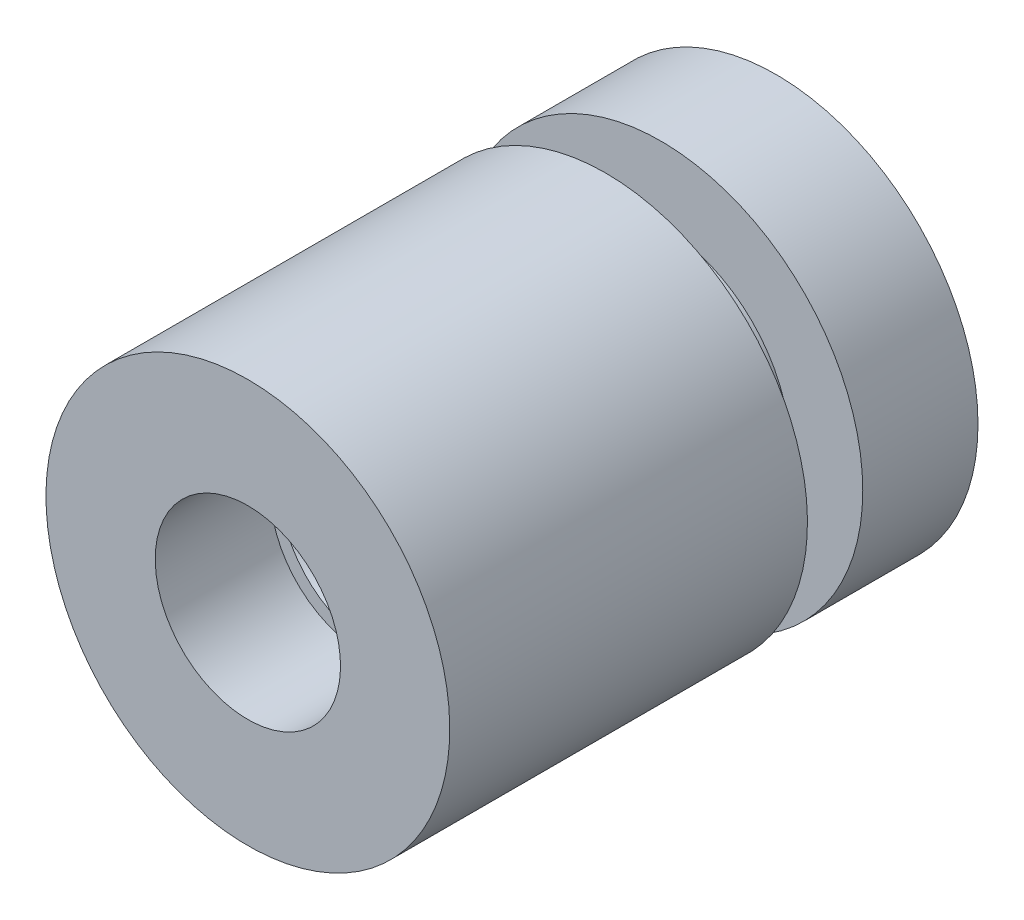
ISO-10303-21;
HEADER;
FILE_DESCRIPTION(('STEP AP214'),'2;1');
FILE_NAME('part.step','',(''),(''),'','','');
FILE_SCHEMA(('AUTOMOTIVE_DESIGN { 1 0 10303 214 1 1 1 1 }'));
ENDSEC;
DATA;
#1=APPLICATION_CONTEXT('core data for automotive mechanical design processes');
#2=APPLICATION_PROTOCOL_DEFINITION('international standard','automotive_design',2000,#1);
#3=PRODUCT_CONTEXT('',#1,'mechanical');
#4=PRODUCT('Part','Part','',(#3));
#5=PRODUCT_RELATED_PRODUCT_CATEGORY('part','',(#4));
#6=PRODUCT_DEFINITION_FORMATION('','',#4);
#7=PRODUCT_DEFINITION_CONTEXT('part definition',#1,'design');
#8=PRODUCT_DEFINITION('design','',#6,#7);
#9=PRODUCT_DEFINITION_SHAPE('','',#8);
#10=(LENGTH_UNIT() NAMED_UNIT(*) SI_UNIT(.MILLI.,.METRE.));
#11=(NAMED_UNIT(*) PLANE_ANGLE_UNIT() SI_UNIT($,.RADIAN.));
#12=(NAMED_UNIT(*) SI_UNIT($,.STERADIAN.) SOLID_ANGLE_UNIT());
#13=UNCERTAINTY_MEASURE_WITH_UNIT(LENGTH_MEASURE(1.E-05),#10,'distance_accuracy_value','');
#14=(GEOMETRIC_REPRESENTATION_CONTEXT(3) GLOBAL_UNCERTAINTY_ASSIGNED_CONTEXT((#13)) GLOBAL_UNIT_ASSIGNED_CONTEXT((#10,
#11,#12)) REPRESENTATION_CONTEXT('',''));
#15=CARTESIAN_POINT('',(0.,0.,0.));
#16=DIRECTION('',(0.,0.,1.));
#17=DIRECTION('',(1.,0.,0.));
#18=AXIS2_PLACEMENT_3D('',#15,#16,#17);
#19=CARTESIAN_POINT('',(0.,0.,18.7386097710099));
#20=DIRECTION('',(0.,0.,-1.));
#21=DIRECTION('',(0.,1.,0.));
#22=AXIS2_PLACEMENT_3D('',#19,#20,#21);
#23=CYLINDRICAL_SURFACE('',#22,3.6195);
#24=CARTESIAN_POINT('',(0.,0.,4.699));
#25=DIRECTION('',(0.,0.,-1.));
#26=DIRECTION('',(0.,1.,0.));
#27=AXIS2_PLACEMENT_3D('',#24,#25,#26);
#28=CIRCLE('',#27,3.6195);
#29=CARTESIAN_POINT('',(0.,3.6195,4.699));
#30=VERTEX_POINT('',#29);
#31=EDGE_CURVE('E11',#30,#30,#28,.T.);
#32=ORIENTED_EDGE('',*,*,#31,.T.);
#33=EDGE_LOOP('',(#32));
#34=FACE_BOUND('',#33,.T.);
#35=CARTESIAN_POINT('',(0.,0.,11.3792));
#36=DIRECTION('',(0.,0.,-1.));
#37=DIRECTION('',(0.,1.,0.));
#38=AXIS2_PLACEMENT_3D('',#35,#36,#37);
#39=CIRCLE('',#38,3.6195);
#40=CARTESIAN_POINT('',(0.,3.6195,11.3792));
#41=VERTEX_POINT('',#40);
#42=EDGE_CURVE('E62',#41,#41,#39,.T.);
#43=ORIENTED_EDGE('',*,*,#42,.F.);
#44=EDGE_LOOP('',(#43));
#45=FACE_BOUND('',#44,.T.);
#46=ADVANCED_FACE('F40',(#34,#45),#23,.F.);
#47=CARTESIAN_POINT('',(0.,3.6195,4.699));
#48=DIRECTION('',(0.,0.,-1.));
#49=DIRECTION('',(0.,1.,0.));
#50=AXIS2_PLACEMENT_3D('',#47,#48,#49);
#51=PLANE('',#50);
#52=CARTESIAN_POINT('',(0.,0.,4.699));
#53=DIRECTION('',(0.,0.,-1.));
#54=DIRECTION('',(0.,1.,0.));
#55=AXIS2_PLACEMENT_3D('',#52,#53,#54);
#56=CIRCLE('',#55,5.5626);
#57=CARTESIAN_POINT('',(0.,5.5626,4.699));
#58=VERTEX_POINT('',#57);
#59=EDGE_CURVE('E46',#58,#58,#56,.T.);
#60=ORIENTED_EDGE('',*,*,#59,.T.);
#61=EDGE_LOOP('',(#60));
#62=FACE_BOUND('',#61,.T.);
#63=ORIENTED_EDGE('',*,*,#31,.F.);
#64=EDGE_LOOP('',(#63));
#65=FACE_BOUND('',#64,.T.);
#66=ADVANCED_FACE('F70',(#62,#65),#51,.T.);
#67=CARTESIAN_POINT('',(0.,0.,18.7386097710099));
#68=DIRECTION('',(0.,0.,-1.));
#69=DIRECTION('',(0.,1.,0.));
#70=AXIS2_PLACEMENT_3D('',#67,#68,#69);
#71=CYLINDRICAL_SURFACE('',#70,5.5626);
#72=CARTESIAN_POINT('',(0.,0.,14.5542));
#73=DIRECTION('',(0.,0.,-1.));
#74=DIRECTION('',(0.,1.,0.));
#75=AXIS2_PLACEMENT_3D('',#72,#73,#74);
#76=CIRCLE('',#75,5.5626);
#77=CARTESIAN_POINT('',(0.,5.5626,14.5542));
#78=VERTEX_POINT('',#77);
#79=EDGE_CURVE('E50',#78,#78,#76,.T.);
#80=ORIENTED_EDGE('',*,*,#79,.T.);
#81=EDGE_LOOP('',(#80));
#82=FACE_BOUND('',#81,.T.);
#83=ORIENTED_EDGE('',*,*,#59,.F.);
#84=EDGE_LOOP('',(#83));
#85=FACE_BOUND('',#84,.T.);
#86=ADVANCED_FACE('F74',(#82,#85),#71,.T.);
#87=CARTESIAN_POINT('',(0.,5.5626,14.5542));
#88=DIRECTION('',(0.,0.,1.));
#89=DIRECTION('',(0.,-1.,0.));
#90=AXIS2_PLACEMENT_3D('',#87,#88,#89);
#91=PLANE('',#90);
#92=CARTESIAN_POINT('',(0.,0.,14.5542));
#93=DIRECTION('',(0.,0.,-1.));
#94=DIRECTION('',(0.,1.,0.));
#95=AXIS2_PLACEMENT_3D('',#92,#93,#94);
#96=CIRCLE('',#95,2.5527);
#97=CARTESIAN_POINT('',(0.,2.5527,14.5542));
#98=VERTEX_POINT('',#97);
#99=EDGE_CURVE('E54',#98,#98,#96,.T.);
#100=ORIENTED_EDGE('',*,*,#99,.T.);
#101=EDGE_LOOP('',(#100));
#102=FACE_BOUND('',#101,.T.);
#103=ORIENTED_EDGE('',*,*,#79,.F.);
#104=EDGE_LOOP('',(#103));
#105=FACE_BOUND('',#104,.T.);
#106=ADVANCED_FACE('F78',(#102,#105),#91,.T.);
#107=CARTESIAN_POINT('',(0.,0.,18.7386097710099));
#108=DIRECTION('',(0.,0.,-1.));
#109=DIRECTION('',(0.,1.,0.));
#110=AXIS2_PLACEMENT_3D('',#107,#108,#109);
#111=CYLINDRICAL_SURFACE('',#110,2.5527);
#112=CARTESIAN_POINT('',(0.,0.,11.3792));
#113=DIRECTION('',(0.,0.,-1.));
#114=DIRECTION('',(0.,1.,0.));
#115=AXIS2_PLACEMENT_3D('',#112,#113,#114);
#116=CIRCLE('',#115,2.5527);
#117=CARTESIAN_POINT('',(0.,2.5527,11.3792));
#118=VERTEX_POINT('',#117);
#119=EDGE_CURVE('E59',#118,#118,#116,.T.);
#120=ORIENTED_EDGE('',*,*,#119,.T.);
#121=EDGE_LOOP('',(#120));
#122=FACE_BOUND('',#121,.T.);
#123=ORIENTED_EDGE('',*,*,#99,.F.);
#124=EDGE_LOOP('',(#123));
#125=FACE_BOUND('',#124,.T.);
#126=ADVANCED_FACE('F85',(#122,#125),#111,.F.);
#127=CARTESIAN_POINT('',(0.,2.5527,11.3792));
#128=DIRECTION('',(0.,0.,-1.));
#129=DIRECTION('',(0.,1.,0.));
#130=AXIS2_PLACEMENT_3D('',#127,#128,#129);
#131=PLANE('',#130);
#132=ORIENTED_EDGE('',*,*,#42,.T.);
#133=EDGE_LOOP('',(#132));
#134=FACE_BOUND('',#133,.T.);
#135=ORIENTED_EDGE('',*,*,#119,.F.);
#136=EDGE_LOOP('',(#135));
#137=FACE_BOUND('',#136,.T.);
#138=ADVANCED_FACE('F66',(#134,#137),#131,.T.);
#139=CLOSED_SHELL('',(#46,#66,#86,#106,#126,#138));
#140=MANIFOLD_SOLID_BREP('B2',#139);
#141=CARTESIAN_POINT('',(0.,0.,-11.6717936301277));
#142=DIRECTION('',(0.,0.,1.));
#143=DIRECTION('',(1.,0.,0.));
#144=AXIS2_PLACEMENT_3D('',#141,#142,#143);
#145=DEGENERATE_TOROIDAL_SURFACE('',#144,0.556680158880791,12.7,.T.);
#146=CARTESIAN_POINT('',(0.,0.,0.872385992622583));
#147=DIRECTION('',(0.,0.,-1.));
#148=DIRECTION('',(-1.,0.,0.));
#149=AXIS2_PLACEMENT_3D('',#146,#147,#148);
#150=CIRCLE('',#149,2.54);
#151=CARTESIAN_POINT('',(-2.54,0.,0.872385992622583));
#152=VERTEX_POINT('',#151);
#153=EDGE_CURVE('E150',#152,#152,#150,.F.);
#154=ORIENTED_EDGE('',*,*,#153,.T.);
#155=EDGE_LOOP('',(#154));
#156=FACE_BOUND('',#155,.T.);
#157=CARTESIAN_POINT('',(0.,0.,0.));
#158=DIRECTION('',(0.,0.,1.));
#159=DIRECTION('',(1.,0.,0.));
#160=AXIS2_PLACEMENT_3D('',#157,#158,#159);
#161=CIRCLE('',#160,5.5626);
#162=CARTESIAN_POINT('',(5.5626,0.,0.));
#163=VERTEX_POINT('',#162);
#164=EDGE_CURVE('E39',#163,#163,#161,.T.);
#165=ORIENTED_EDGE('',*,*,#164,.F.);
#166=EDGE_LOOP('',(#165));
#167=FACE_BOUND('',#166,.T.);
#168=ADVANCED_FACE('F131',(#156,#167),#145,.F.);
#169=CARTESIAN_POINT('',(0.,0.,-3.09597309854337));
#170=DIRECTION('',(0.,0.,1.));
#171=DIRECTION('',(1.,0.,0.));
#172=AXIS2_PLACEMENT_3D('',#169,#170,#171);
#173=CYLINDRICAL_SURFACE('',#172,5.5626);
#174=CARTESIAN_POINT('',(0.,0.,3.175));
#175=DIRECTION('',(0.,0.,1.));
#176=DIRECTION('',(1.,0.,0.));
#177=AXIS2_PLACEMENT_3D('',#174,#175,#176);
#178=CIRCLE('',#177,5.5626);
#179=CARTESIAN_POINT('',(5.5626,0.,3.175));
#180=VERTEX_POINT('',#179);
#181=EDGE_CURVE('E137',#180,#180,#178,.T.);
#182=ORIENTED_EDGE('',*,*,#181,.F.);
#183=EDGE_LOOP('',(#182));
#184=FACE_BOUND('',#183,.T.);
#185=ORIENTED_EDGE('',*,*,#164,.T.);
#186=EDGE_LOOP('',(#185));
#187=FACE_BOUND('',#186,.T.);
#188=ADVANCED_FACE('F200',(#184,#187),#173,.T.);
#189=CARTESIAN_POINT('',(0.,5.5626,3.175));
#190=DIRECTION('',(0.,0.,-1.));
#191=DIRECTION('',(-1.,0.,0.));
#192=AXIS2_PLACEMENT_3D('',#189,#190,#191);
#193=PLANE('',#192);
#194=CARTESIAN_POINT('',(0.,0.,3.175));
#195=DIRECTION('',(0.,0.,1.));
#196=DIRECTION('',(1.,0.,0.));
#197=AXIS2_PLACEMENT_3D('',#194,#195,#196);
#198=CIRCLE('',#197,3.556);
#199=CARTESIAN_POINT('',(3.556,0.,3.175));
#200=VERTEX_POINT('',#199);
#201=EDGE_CURVE('E141',#200,#200,#198,.T.);
#202=ORIENTED_EDGE('',*,*,#201,.F.);
#203=EDGE_LOOP('',(#202));
#204=FACE_BOUND('',#203,.T.);
#205=ORIENTED_EDGE('',*,*,#181,.T.);
#206=EDGE_LOOP('',(#205));
#207=FACE_BOUND('',#206,.T.);
#208=ADVANCED_FACE('F195',(#204,#207),#193,.F.);
#209=CARTESIAN_POINT('',(0.,0.,-3.09597309854337));
#210=DIRECTION('',(0.,0.,1.));
#211=DIRECTION('',(1.,0.,0.));
#212=AXIS2_PLACEMENT_3D('',#209,#210,#211);
#213=CYLINDRICAL_SURFACE('',#212,3.556);
#214=CARTESIAN_POINT('',(0.,0.,11.1252));
#215=DIRECTION('',(0.,0.,1.));
#216=DIRECTION('',(1.,0.,0.));
#217=AXIS2_PLACEMENT_3D('',#214,#215,#216);
#218=CIRCLE('',#217,3.556);
#219=CARTESIAN_POINT('',(3.556,0.,11.1252));
#220=VERTEX_POINT('',#219);
#221=EDGE_CURVE('E145',#220,#220,#218,.T.);
#222=ORIENTED_EDGE('',*,*,#221,.F.);
#223=EDGE_LOOP('',(#222));
#224=FACE_BOUND('',#223,.T.);
#225=ORIENTED_EDGE('',*,*,#201,.T.);
#226=EDGE_LOOP('',(#225));
#227=FACE_BOUND('',#226,.T.);
#228=ADVANCED_FACE('F189',(#224,#227),#213,.T.);
#229=CARTESIAN_POINT('',(0.,3.556,11.1252));
#230=DIRECTION('',(0.,0.,-1.));
#231=DIRECTION('',(-1.,0.,0.));
#232=AXIS2_PLACEMENT_3D('',#229,#230,#231);
#233=PLANE('',#232);
#234=CARTESIAN_POINT('',(0.,0.,11.1252));
#235=DIRECTION('',(0.,0.,1.));
#236=DIRECTION('',(1.,0.,0.));
#237=AXIS2_PLACEMENT_3D('',#234,#235,#236);
#238=CIRCLE('',#237,2.54);
#239=CARTESIAN_POINT('',(2.54,0.,11.1252));
#240=VERTEX_POINT('',#239);
#241=EDGE_CURVE('E159',#240,#240,#238,.T.);
#242=ORIENTED_EDGE('',*,*,#241,.F.);
#243=EDGE_LOOP('',(#242));
#244=FACE_BOUND('',#243,.T.);
#245=ORIENTED_EDGE('',*,*,#221,.T.);
#246=EDGE_LOOP('',(#245));
#247=FACE_BOUND('',#246,.T.);
#248=ADVANCED_FACE('F172',(#244,#247),#233,.F.);
#249=CARTESIAN_POINT('',(0.,0.,1.5367));
#250=DIRECTION('',(0.,0.,-1.));
#251=DIRECTION('',(-1.,0.,0.));
#252=AXIS2_PLACEMENT_3D('',#249,#250,#251);
#253=CONICAL_SURFACE('',#252,2.0193,0.78539816339745);
#254=CARTESIAN_POINT('',(0.,0.,1.016));
#255=DIRECTION('',(0.,0.,1.));
#256=DIRECTION('',(1.,0.,0.));
#257=AXIS2_PLACEMENT_3D('',#254,#255,#256);
#258=CIRCLE('',#257,2.54);
#259=CARTESIAN_POINT('',(2.54,0.,1.016));
#260=VERTEX_POINT('',#259);
#261=EDGE_CURVE('E162',#260,#260,#258,.T.);
#262=ORIENTED_EDGE('',*,*,#261,.F.);
#263=EDGE_LOOP('',(#262));
#264=FACE_BOUND('',#263,.T.);
#265=CARTESIAN_POINT('',(0.,0.,1.5367));
#266=DIRECTION('',(0.,0.,1.));
#267=DIRECTION('',(1.,0.,0.));
#268=AXIS2_PLACEMENT_3D('',#265,#266,#267);
#269=CIRCLE('',#268,2.0193);
#270=CARTESIAN_POINT('',(2.0193,0.,1.5367));
#271=VERTEX_POINT('',#270);
#272=EDGE_CURVE('E153',#271,#271,#269,.T.);
#273=ORIENTED_EDGE('',*,*,#272,.T.);
#274=EDGE_LOOP('',(#273));
#275=FACE_BOUND('',#274,.T.);
#276=ADVANCED_FACE('F168',(#264,#275),#253,.F.);
#277=CARTESIAN_POINT('',(0.,0.,11.1252));
#278=DIRECTION('',(0.,0.,1.));
#279=DIRECTION('',(1.,0.,0.));
#280=AXIS2_PLACEMENT_3D('',#277,#278,#279);
#281=CYLINDRICAL_SURFACE('',#280,2.0193);
#282=ORIENTED_EDGE('',*,*,#272,.F.);
#283=EDGE_LOOP('',(#282));
#284=FACE_BOUND('',#283,.T.);
#285=CARTESIAN_POINT('',(0.,0.,10.6045));
#286=DIRECTION('',(0.,0.,1.));
#287=DIRECTION('',(1.,0.,0.));
#288=AXIS2_PLACEMENT_3D('',#285,#286,#287);
#289=CIRCLE('',#288,2.0193);
#290=CARTESIAN_POINT('',(2.0193,0.,10.6045));
#291=VERTEX_POINT('',#290);
#292=EDGE_CURVE('E156',#291,#291,#289,.T.);
#293=ORIENTED_EDGE('',*,*,#292,.T.);
#294=EDGE_LOOP('',(#293));
#295=FACE_BOUND('',#294,.T.);
#296=ADVANCED_FACE('F171',(#284,#295),#281,.F.);
#297=CARTESIAN_POINT('',(0.,0.,11.1252));
#298=DIRECTION('',(0.,0.,1.));
#299=DIRECTION('',(1.,0.,0.));
#300=AXIS2_PLACEMENT_3D('',#297,#298,#299);
#301=CONICAL_SURFACE('',#300,2.54,0.785398163397448);
#302=ORIENTED_EDGE('',*,*,#292,.F.);
#303=EDGE_LOOP('',(#302));
#304=FACE_BOUND('',#303,.T.);
#305=ORIENTED_EDGE('',*,*,#241,.T.);
#306=EDGE_LOOP('',(#305));
#307=FACE_BOUND('',#306,.T.);
#308=ADVANCED_FACE('F178',(#304,#307),#301,.F.);
#309=CARTESIAN_POINT('',(0.,0.,1.016));
#310=DIRECTION('',(0.,0.,1.));
#311=DIRECTION('',(1.,0.,0.));
#312=AXIS2_PLACEMENT_3D('',#309,#310,#311);
#313=CYLINDRICAL_SURFACE('',#312,2.54);
#314=ORIENTED_EDGE('',*,*,#153,.F.);
#315=EDGE_LOOP('',(#314));
#316=FACE_BOUND('',#315,.T.);
#317=ORIENTED_EDGE('',*,*,#261,.T.);
#318=EDGE_LOOP('',(#317));
#319=FACE_BOUND('',#318,.T.);
#320=ADVANCED_FACE('F166',(#316,#319),#313,.F.);
#321=CLOSED_SHELL('',(#168,#188,#208,#228,#248,#276,#296,#308,#320));
#322=MANIFOLD_SOLID_BREP('B6',#321);
#323=ADVANCED_BREP_SHAPE_REPRESENTATION('',(#18,#140,#322),#14);
#324=SHAPE_DEFINITION_REPRESENTATION(#9,#323);
ENDSEC;
END-ISO-10303-21;
